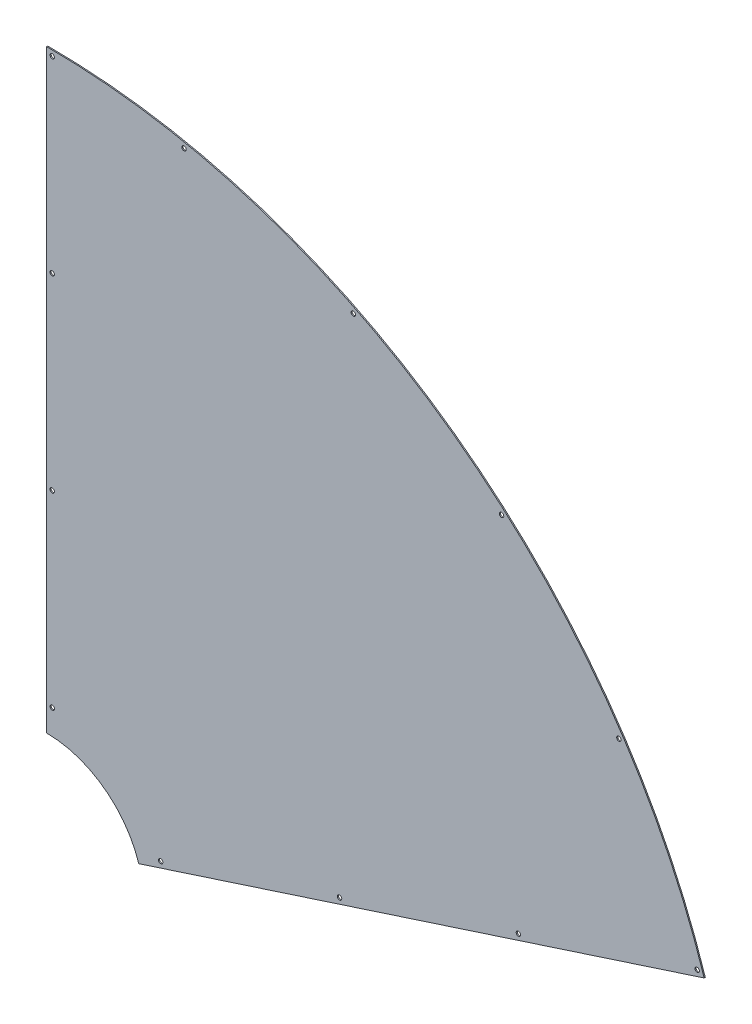
ISO-10303-21;
HEADER;
FILE_DESCRIPTION(('STEP AP214'),'2;1');
FILE_NAME('part.step','',(''),(''),'','','');
FILE_SCHEMA(('AUTOMOTIVE_DESIGN { 1 0 10303 214 1 1 1 1 }'));
ENDSEC;
DATA;
#1=APPLICATION_CONTEXT('core data for automotive mechanical design processes');
#2=APPLICATION_PROTOCOL_DEFINITION('international standard','automotive_design',2000,#1);
#3=PRODUCT_CONTEXT('',#1,'mechanical');
#4=PRODUCT('Part','Part','',(#3));
#5=PRODUCT_RELATED_PRODUCT_CATEGORY('part','',(#4));
#6=PRODUCT_DEFINITION_FORMATION('','',#4);
#7=PRODUCT_DEFINITION_CONTEXT('part definition',#1,'design');
#8=PRODUCT_DEFINITION('design','',#6,#7);
#9=PRODUCT_DEFINITION_SHAPE('','',#8);
#10=(LENGTH_UNIT() NAMED_UNIT(*) SI_UNIT(.MILLI.,.METRE.));
#11=(NAMED_UNIT(*) PLANE_ANGLE_UNIT() SI_UNIT($,.RADIAN.));
#12=(NAMED_UNIT(*) SI_UNIT($,.STERADIAN.) SOLID_ANGLE_UNIT());
#13=UNCERTAINTY_MEASURE_WITH_UNIT(LENGTH_MEASURE(1.E-05),#10,'distance_accuracy_value','');
#14=(GEOMETRIC_REPRESENTATION_CONTEXT(3) GLOBAL_UNCERTAINTY_ASSIGNED_CONTEXT((#13)) GLOBAL_UNIT_ASSIGNED_CONTEXT((#10,
#11,#12)) REPRESENTATION_CONTEXT('',''));
#15=CARTESIAN_POINT('',(0.,0.,0.));
#16=DIRECTION('',(0.,0.,1.));
#17=DIRECTION('',(1.,0.,0.));
#18=AXIS2_PLACEMENT_3D('',#15,#16,#17);
#19=CARTESIAN_POINT('',(248.343744291146,1214.87669525407,2.));
#20=DIRECTION('',(0.,0.,-1.));
#21=DIRECTION('',(-0.499999999999998,-0.86602540378444,0.));
#22=AXIS2_PLACEMENT_3D('',#19,#20,#21);
#23=CYLINDRICAL_SURFACE('',#22,3.99999999999999);
#24=CARTESIAN_POINT('',(248.343744291146,1214.87669525407,2.));
#25=DIRECTION('',(0.,0.,1.));
#26=DIRECTION('',(0.499999999999998,0.86602540378444,0.));
#27=AXIS2_PLACEMENT_3D('',#24,#25,#26);
#28=CIRCLE('',#27,3.99999999999999);
#29=CARTESIAN_POINT('',(250.343744291146,1218.34079686921,2.));
#30=VERTEX_POINT('',#29);
#31=EDGE_CURVE('E42',#30,#30,#28,.T.);
#32=ORIENTED_EDGE('',*,*,#31,.T.);
#33=EDGE_LOOP('',(#32));
#34=FACE_BOUND('',#33,.T.);
#35=CARTESIAN_POINT('',(248.343744291146,1214.87669525407,0.));
#36=DIRECTION('',(0.,0.,1.));
#37=DIRECTION('',(0.499999999999998,0.86602540378444,0.));
#38=AXIS2_PLACEMENT_3D('',#35,#36,#37);
#39=CIRCLE('',#38,3.99999999999999);
#40=CARTESIAN_POINT('',(250.343744291146,1218.34079686921,0.));
#41=VERTEX_POINT('',#40);
#42=EDGE_CURVE('E11',#41,#41,#39,.T.);
#43=ORIENTED_EDGE('',*,*,#42,.F.);
#44=EDGE_LOOP('',(#43));
#45=FACE_BOUND('',#44,.T.);
#46=ADVANCED_FACE('F34',(#34,#45),#23,.F.);
#47=CARTESIAN_POINT('',(554.314862591112,1109.204684948,2.));
#48=DIRECTION('',(0.,0.,-1.));
#49=DIRECTION('',(-0.707106781186546,-0.707106781186549,0.));
#50=AXIS2_PLACEMENT_3D('',#47,#48,#49);
#51=CYLINDRICAL_SURFACE('',#50,3.99999999999999);
#52=CARTESIAN_POINT('',(554.314862591112,1109.204684948,2.));
#53=DIRECTION('',(0.,0.,1.));
#54=DIRECTION('',(0.707106781186546,0.707106781186549,0.));
#55=AXIS2_PLACEMENT_3D('',#52,#53,#54);
#56=CIRCLE('',#55,3.99999999999999);
#57=CARTESIAN_POINT('',(557.143289715858,1112.03311207275,2.));
#58=VERTEX_POINT('',#57);
#59=EDGE_CURVE('E124',#58,#58,#56,.T.);
#60=ORIENTED_EDGE('',*,*,#59,.T.);
#61=EDGE_LOOP('',(#60));
#62=FACE_BOUND('',#61,.T.);
#63=CARTESIAN_POINT('',(554.314862591112,1109.204684948,0.));
#64=DIRECTION('',(0.,0.,1.));
#65=DIRECTION('',(0.707106781186546,0.707106781186549,0.));
#66=AXIS2_PLACEMENT_3D('',#63,#64,#65);
#67=CIRCLE('',#66,3.99999999999999);
#68=CARTESIAN_POINT('',(557.143289715858,1112.03311207275,0.));
#69=VERTEX_POINT('',#68);
#70=EDGE_CURVE('E127',#69,#69,#67,.T.);
#71=ORIENTED_EDGE('',*,*,#70,.F.);
#72=EDGE_LOOP('',(#71));
#73=FACE_BOUND('',#72,.T.);
#74=ADVANCED_FACE('F222',(#62,#73),#51,.F.);
#75=CARTESIAN_POINT('',(822.510339054116,927.942208410137,2.));
#76=DIRECTION('',(0.,0.,-1.));
#77=DIRECTION('',(-0.866025403784438,-0.500000000000001,0.));
#78=AXIS2_PLACEMENT_3D('',#75,#76,#77);
#79=CYLINDRICAL_SURFACE('',#78,3.99999999999999);
#80=CARTESIAN_POINT('',(822.510339054116,927.942208410137,2.));
#81=DIRECTION('',(0.,0.,1.));
#82=DIRECTION('',(0.866025403784438,0.500000000000001,0.));
#83=AXIS2_PLACEMENT_3D('',#80,#81,#82);
#84=CIRCLE('',#83,3.99999999999999);
#85=CARTESIAN_POINT('',(825.974440669254,929.942208410137,2.));
#86=VERTEX_POINT('',#85);
#87=EDGE_CURVE('E118',#86,#86,#84,.T.);
#88=ORIENTED_EDGE('',*,*,#87,.T.);
#89=EDGE_LOOP('',(#88));
#90=FACE_BOUND('',#89,.T.);
#91=CARTESIAN_POINT('',(822.510339054116,927.942208410137,0.));
#92=DIRECTION('',(0.,0.,1.));
#93=DIRECTION('',(0.866025403784438,0.500000000000001,0.));
#94=AXIS2_PLACEMENT_3D('',#91,#92,#93);
#95=CIRCLE('',#94,3.99999999999999);
#96=CARTESIAN_POINT('',(825.974440669254,929.942208410137,0.));
#97=VERTEX_POINT('',#96);
#98=EDGE_CURVE('E121',#97,#97,#95,.T.);
#99=ORIENTED_EDGE('',*,*,#98,.F.);
#100=EDGE_LOOP('',(#99));
#101=FACE_BOUND('',#100,.T.);
#102=ADVANCED_FACE('F226',(#90,#101),#79,.F.);
#103=CARTESIAN_POINT('',(1034.65309517319,683.442003866127,2.));
#104=DIRECTION('',(0.,0.,-1.));
#105=DIRECTION('',(-0.965925826289068,-0.258819045102521,0.));
#106=AXIS2_PLACEMENT_3D('',#103,#104,#105);
#107=CYLINDRICAL_SURFACE('',#106,3.99999999999999);
#108=CARTESIAN_POINT('',(1034.65309517319,683.442003866127,2.));
#109=DIRECTION('',(0.,0.,1.));
#110=DIRECTION('',(0.965925826289068,0.258819045102521,0.));
#111=AXIS2_PLACEMENT_3D('',#108,#109,#110);
#112=CIRCLE('',#111,3.99999999999999);
#113=CARTESIAN_POINT('',(1038.51679847834,684.477280046537,2.));
#114=VERTEX_POINT('',#113);
#115=EDGE_CURVE('E112',#114,#114,#112,.T.);
#116=ORIENTED_EDGE('',*,*,#115,.T.);
#117=EDGE_LOOP('',(#116));
#118=FACE_BOUND('',#117,.T.);
#119=CARTESIAN_POINT('',(1034.65309517319,683.442003866127,0.));
#120=DIRECTION('',(0.,0.,1.));
#121=DIRECTION('',(0.965925826289068,0.258819045102521,0.));
#122=AXIS2_PLACEMENT_3D('',#119,#120,#121);
#123=CIRCLE('',#122,3.99999999999999);
#124=CARTESIAN_POINT('',(1038.51679847834,684.477280046537,0.));
#125=VERTEX_POINT('',#124);
#126=EDGE_CURVE('E115',#125,#125,#123,.T.);
#127=ORIENTED_EDGE('',*,*,#126,.F.);
#128=EDGE_LOOP('',(#127));
#129=FACE_BOUND('',#128,.T.);
#130=ADVANCED_FACE('F137',(#118,#129),#107,.F.);
#131=CARTESIAN_POINT('',(0.,0.,2.));
#132=DIRECTION('',(0.,0.,1.));
#133=DIRECTION('',(1.,0.,0.));
#134=AXIS2_PLACEMENT_3D('',#131,#132,#133);
#135=PLANE('',#134);
#136=ORIENTED_EDGE('',*,*,#31,.F.);
#137=EDGE_LOOP('',(#136));
#138=FACE_BOUND('',#137,.T.);
#139=ORIENTED_EDGE('',*,*,#59,.F.);
#140=EDGE_LOOP('',(#139));
#141=FACE_BOUND('',#140,.T.);
#142=ORIENTED_EDGE('',*,*,#87,.F.);
#143=EDGE_LOOP('',(#142));
#144=FACE_BOUND('',#143,.T.);
#145=ORIENTED_EDGE('',*,*,#115,.F.);
#146=EDGE_LOOP('',(#145));
#147=FACE_BOUND('',#146,.T.);
#148=CARTESIAN_POINT('',(10.,1239.95967676372,2.));
#149=DIRECTION('',(0.,0.,1.));
#150=DIRECTION('',(1.,0.,0.));
#151=AXIS2_PLACEMENT_3D('',#148,#149,#150);
#152=CIRCLE('',#151,4.);
#153=CARTESIAN_POINT('',(14.,1239.95967676372,2.));
#154=VERTEX_POINT('',#153);
#155=EDGE_CURVE('E148',#154,#154,#152,.T.);
#156=ORIENTED_EDGE('',*,*,#155,.F.);
#157=EDGE_LOOP('',(#156));
#158=FACE_BOUND('',#157,.T.);
#159=CARTESIAN_POINT('',(10.0000000000001,559.959676763724,2.));
#160=DIRECTION('',(0.,0.,1.));
#161=DIRECTION('',(1.,0.,0.));
#162=AXIS2_PLACEMENT_3D('',#159,#160,#161);
#163=CIRCLE('',#162,4.);
#164=CARTESIAN_POINT('',(14.0000000000001,559.959676763724,2.));
#165=VERTEX_POINT('',#164);
#166=EDGE_CURVE('E152',#165,#165,#163,.T.);
#167=ORIENTED_EDGE('',*,*,#166,.F.);
#168=EDGE_LOOP('',(#167));
#169=FACE_BOUND('',#168,.T.);
#170=CARTESIAN_POINT('',(852.926737160934,287.30057811247,2.));
#171=DIRECTION('',(0.,0.,1.));
#172=DIRECTION('',(1.,0.,0.));
#173=AXIS2_PLACEMENT_3D('',#170,#171,#172);
#174=CIRCLE('',#173,3.99999999999999);
#175=CARTESIAN_POINT('',(856.926737160934,287.30057811247,2.));
#176=VERTEX_POINT('',#175);
#177=EDGE_CURVE('E156',#176,#176,#174,.T.);
#178=ORIENTED_EDGE('',*,*,#177,.F.);
#179=EDGE_LOOP('',(#178));
#180=FACE_BOUND('',#179,.T.);
#181=CARTESIAN_POINT('',(206.086847975223,77.5435693609763,2.));
#182=DIRECTION('',(0.,0.,1.));
#183=DIRECTION('',(1.,0.,0.));
#184=AXIS2_PLACEMENT_3D('',#181,#182,#183);
#185=CIRCLE('',#184,3.99999999999999);
#186=CARTESIAN_POINT('',(210.086847975223,77.5435693609763,2.));
#187=VERTEX_POINT('',#186);
#188=EDGE_CURVE('E105',#187,#187,#185,.T.);
#189=ORIENTED_EDGE('',*,*,#188,.F.);
#190=EDGE_LOOP('',(#189));
#191=FACE_BOUND('',#190,.T.);
#192=CARTESIAN_POINT('',(0.,0.,2.));
#193=DIRECTION('',(0.,0.,1.));
#194=DIRECTION('',(1.,0.,0.));
#195=AXIS2_PLACEMENT_3D('',#192,#193,#194);
#196=CIRCLE('',#195,1250.);
#197=CARTESIAN_POINT('',(1188.92250846813,385.957599818763,2.));
#198=VERTEX_POINT('',#197);
#199=CARTESIAN_POINT('',(0.,1250.,2.));
#200=VERTEX_POINT('',#199);
#201=EDGE_CURVE('E87',#198,#200,#196,.T.);
#202=ORIENTED_EDGE('',*,*,#201,.T.);
#203=DIRECTION('',(0.,-1.,0.));
#204=VECTOR('',#203,1.);
#205=CARTESIAN_POINT('',(0.,1250.,2.));
#206=LINE('',#205,#204);
#207=CARTESIAN_POINT('',(0.,175.,2.));
#208=VERTEX_POINT('',#207);
#209=EDGE_CURVE('E81',#200,#208,#206,.T.);
#210=ORIENTED_EDGE('',*,*,#209,.T.);
#211=CARTESIAN_POINT('',(0.,0.,2.));
#212=DIRECTION('',(0.,0.,-1.));
#213=DIRECTION('',(1.,0.,0.));
#214=AXIS2_PLACEMENT_3D('',#211,#212,#213);
#215=CIRCLE('',#214,175.);
#216=CARTESIAN_POINT('',(166.536499319094,53.7642482932808,2.));
#217=VERTEX_POINT('',#216);
#218=EDGE_CURVE('E85',#208,#217,#215,.T.);
#219=ORIENTED_EDGE('',*,*,#218,.T.);
#220=DIRECTION('',(0.951056516295152,0.309016994374952,0.));
#221=VECTOR('',#220,1.);
#222=CARTESIAN_POINT('',(166.536499319094,53.7642482932808,2.));
#223=LINE('',#222,#221);
#224=EDGE_CURVE('E50',#217,#198,#223,.T.);
#225=ORIENTED_EDGE('',*,*,#224,.T.);
#226=EDGE_LOOP('',(#202,#210,#219,#225));
#227=FACE_BOUND('',#226,.T.);
#228=CARTESIAN_POINT('',(529.567521620582,182.234800024986,2.));
#229=DIRECTION('',(0.,0.,1.));
#230=DIRECTION('',(1.,0.,0.));
#231=AXIS2_PLACEMENT_3D('',#228,#229,#230);
#232=CIRCLE('',#231,3.99999999999999);
#233=CARTESIAN_POINT('',(533.567521620582,182.234800024986,2.));
#234=VERTEX_POINT('',#233);
#235=EDGE_CURVE('E163',#234,#234,#232,.T.);
#236=ORIENTED_EDGE('',*,*,#235,.F.);
#237=EDGE_LOOP('',(#236));
#238=FACE_BOUND('',#237,.T.);
#239=CARTESIAN_POINT('',(10.0000000000001,219.959676763724,2.));
#240=DIRECTION('',(0.,0.,1.));
#241=DIRECTION('',(1.,0.,0.));
#242=AXIS2_PLACEMENT_3D('',#239,#240,#241);
#243=CIRCLE('',#242,4.);
#244=CARTESIAN_POINT('',(14.0000000000001,219.959676763724,2.));
#245=VERTEX_POINT('',#244);
#246=EDGE_CURVE('E174',#245,#245,#243,.T.);
#247=ORIENTED_EDGE('',*,*,#246,.F.);
#248=EDGE_LOOP('',(#247));
#249=FACE_BOUND('',#248,.T.);
#250=CARTESIAN_POINT('',(10.,899.959676763724,2.));
#251=DIRECTION('',(0.,0.,1.));
#252=DIRECTION('',(1.,0.,0.));
#253=AXIS2_PLACEMENT_3D('',#250,#251,#252);
#254=CIRCLE('',#253,4.);
#255=CARTESIAN_POINT('',(14.,899.959676763724,2.));
#256=VERTEX_POINT('',#255);
#257=EDGE_CURVE('E184',#256,#256,#254,.T.);
#258=ORIENTED_EDGE('',*,*,#257,.F.);
#259=EDGE_LOOP('',(#258));
#260=FACE_BOUND('',#259,.T.);
#261=CARTESIAN_POINT('',(1176.28595270129,392.366356199954,2.));
#262=DIRECTION('',(0.,0.,1.));
#263=DIRECTION('',(1.,0.,0.));
#264=AXIS2_PLACEMENT_3D('',#261,#262,#263);
#265=CIRCLE('',#264,3.99999999999999);
#266=CARTESIAN_POINT('',(1180.28595270129,392.366356199954,2.));
#267=VERTEX_POINT('',#266);
#268=EDGE_CURVE('E194',#267,#267,#265,.T.);
#269=ORIENTED_EDGE('',*,*,#268,.F.);
#270=EDGE_LOOP('',(#269));
#271=FACE_BOUND('',#270,.T.);
#272=ADVANCED_FACE('F82',(#138,#141,#144,#147,#158,#169,#180,#191,#227,#238,#249,#260,#271),
#135,.T.);
#273=CARTESIAN_POINT('',(0.,0.,0.));
#274=DIRECTION('',(0.,0.,1.));
#275=DIRECTION('',(1.,0.,0.));
#276=AXIS2_PLACEMENT_3D('',#273,#274,#275);
#277=PLANE('',#276);
#278=ORIENTED_EDGE('',*,*,#42,.T.);
#279=EDGE_LOOP('',(#278));
#280=FACE_BOUND('',#279,.T.);
#281=ORIENTED_EDGE('',*,*,#70,.T.);
#282=EDGE_LOOP('',(#281));
#283=FACE_BOUND('',#282,.T.);
#284=ORIENTED_EDGE('',*,*,#98,.T.);
#285=EDGE_LOOP('',(#284));
#286=FACE_BOUND('',#285,.T.);
#287=ORIENTED_EDGE('',*,*,#126,.T.);
#288=EDGE_LOOP('',(#287));
#289=FACE_BOUND('',#288,.T.);
#290=CARTESIAN_POINT('',(0.,0.,0.));
#291=DIRECTION('',(0.,0.,1.));
#292=DIRECTION('',(1.,0.,0.));
#293=AXIS2_PLACEMENT_3D('',#290,#291,#292);
#294=CIRCLE('',#293,1250.);
#295=CARTESIAN_POINT('',(1188.92250846813,385.957599818763,0.));
#296=VERTEX_POINT('',#295);
#297=CARTESIAN_POINT('',(0.,1250.,0.));
#298=VERTEX_POINT('',#297);
#299=EDGE_CURVE('E102',#296,#298,#294,.T.);
#300=ORIENTED_EDGE('',*,*,#299,.F.);
#301=DIRECTION('',(0.951056516295152,0.309016994374952,0.));
#302=VECTOR('',#301,1.);
#303=CARTESIAN_POINT('',(166.536499319094,53.7642482932808,0.));
#304=LINE('',#303,#302);
#305=CARTESIAN_POINT('',(166.536499319094,53.7642482932808,0.));
#306=VERTEX_POINT('',#305);
#307=EDGE_CURVE('E73',#306,#296,#304,.T.);
#308=ORIENTED_EDGE('',*,*,#307,.F.);
#309=CARTESIAN_POINT('',(0.,0.,0.));
#310=DIRECTION('',(0.,0.,-1.));
#311=DIRECTION('',(1.,0.,0.));
#312=AXIS2_PLACEMENT_3D('',#309,#310,#311);
#313=CIRCLE('',#312,175.);
#314=CARTESIAN_POINT('',(0.,175.,0.));
#315=VERTEX_POINT('',#314);
#316=EDGE_CURVE('E67',#315,#306,#313,.T.);
#317=ORIENTED_EDGE('',*,*,#316,.F.);
#318=DIRECTION('',(0.,-1.,0.));
#319=VECTOR('',#318,1.);
#320=CARTESIAN_POINT('',(0.,1250.,0.));
#321=LINE('',#320,#319);
#322=EDGE_CURVE('E92',#298,#315,#321,.T.);
#323=ORIENTED_EDGE('',*,*,#322,.F.);
#324=EDGE_LOOP('',(#300,#308,#317,#323));
#325=FACE_BOUND('',#324,.T.);
#326=CARTESIAN_POINT('',(206.086847975223,77.5435693609763,0.));
#327=DIRECTION('',(0.,0.,1.));
#328=DIRECTION('',(1.,0.,0.));
#329=AXIS2_PLACEMENT_3D('',#326,#327,#328);
#330=CIRCLE('',#329,3.99999999999999);
#331=CARTESIAN_POINT('',(210.086847975223,77.5435693609763,0.));
#332=VERTEX_POINT('',#331);
#333=EDGE_CURVE('E160',#332,#332,#330,.T.);
#334=ORIENTED_EDGE('',*,*,#333,.T.);
#335=EDGE_LOOP('',(#334));
#336=FACE_BOUND('',#335,.T.);
#337=CARTESIAN_POINT('',(529.567521620582,182.234800024986,0.));
#338=DIRECTION('',(0.,0.,1.));
#339=DIRECTION('',(1.,0.,0.));
#340=AXIS2_PLACEMENT_3D('',#337,#338,#339);
#341=CIRCLE('',#340,3.99999999999999);
#342=CARTESIAN_POINT('',(533.567521620582,182.234800024986,0.));
#343=VERTEX_POINT('',#342);
#344=EDGE_CURVE('E166',#343,#343,#341,.T.);
#345=ORIENTED_EDGE('',*,*,#344,.T.);
#346=EDGE_LOOP('',(#345));
#347=FACE_BOUND('',#346,.T.);
#348=CARTESIAN_POINT('',(852.926737160934,287.30057811247,0.));
#349=DIRECTION('',(0.,0.,1.));
#350=DIRECTION('',(1.,0.,0.));
#351=AXIS2_PLACEMENT_3D('',#348,#349,#350);
#352=CIRCLE('',#351,3.99999999999999);
#353=CARTESIAN_POINT('',(856.926737160934,287.30057811247,0.));
#354=VERTEX_POINT('',#353);
#355=EDGE_CURVE('E171',#354,#354,#352,.T.);
#356=ORIENTED_EDGE('',*,*,#355,.T.);
#357=EDGE_LOOP('',(#356));
#358=FACE_BOUND('',#357,.T.);
#359=CARTESIAN_POINT('',(10.0000000000001,219.959676763724,0.));
#360=DIRECTION('',(0.,0.,1.));
#361=DIRECTION('',(1.,0.,0.));
#362=AXIS2_PLACEMENT_3D('',#359,#360,#361);
#363=CIRCLE('',#362,4.);
#364=CARTESIAN_POINT('',(14.0000000000001,219.959676763724,0.));
#365=VERTEX_POINT('',#364);
#366=EDGE_CURVE('E176',#365,#365,#363,.T.);
#367=ORIENTED_EDGE('',*,*,#366,.T.);
#368=EDGE_LOOP('',(#367));
#369=FACE_BOUND('',#368,.T.);
#370=CARTESIAN_POINT('',(10.0000000000001,559.959676763724,0.));
#371=DIRECTION('',(0.,0.,1.));
#372=DIRECTION('',(1.,0.,0.));
#373=AXIS2_PLACEMENT_3D('',#370,#371,#372);
#374=CIRCLE('',#373,4.);
#375=CARTESIAN_POINT('',(14.0000000000001,559.959676763724,0.));
#376=VERTEX_POINT('',#375);
#377=EDGE_CURVE('E181',#376,#376,#374,.T.);
#378=ORIENTED_EDGE('',*,*,#377,.T.);
#379=EDGE_LOOP('',(#378));
#380=FACE_BOUND('',#379,.T.);
#381=CARTESIAN_POINT('',(10.,899.959676763724,0.));
#382=DIRECTION('',(0.,0.,1.));
#383=DIRECTION('',(1.,0.,0.));
#384=AXIS2_PLACEMENT_3D('',#381,#382,#383);
#385=CIRCLE('',#384,4.);
#386=CARTESIAN_POINT('',(14.,899.959676763724,0.));
#387=VERTEX_POINT('',#386);
#388=EDGE_CURVE('E186',#387,#387,#385,.T.);
#389=ORIENTED_EDGE('',*,*,#388,.T.);
#390=EDGE_LOOP('',(#389));
#391=FACE_BOUND('',#390,.T.);
#392=CARTESIAN_POINT('',(10.,1239.95967676372,0.));
#393=DIRECTION('',(0.,0.,1.));
#394=DIRECTION('',(1.,0.,0.));
#395=AXIS2_PLACEMENT_3D('',#392,#393,#394);
#396=CIRCLE('',#395,4.);
#397=CARTESIAN_POINT('',(14.,1239.95967676372,0.));
#398=VERTEX_POINT('',#397);
#399=EDGE_CURVE('E191',#398,#398,#396,.T.);
#400=ORIENTED_EDGE('',*,*,#399,.T.);
#401=EDGE_LOOP('',(#400));
#402=FACE_BOUND('',#401,.T.);
#403=CARTESIAN_POINT('',(1176.28595270129,392.366356199954,0.));
#404=DIRECTION('',(0.,0.,1.));
#405=DIRECTION('',(1.,0.,0.));
#406=AXIS2_PLACEMENT_3D('',#403,#404,#405);
#407=CIRCLE('',#406,3.99999999999999);
#408=CARTESIAN_POINT('',(1180.28595270129,392.366356199954,0.));
#409=VERTEX_POINT('',#408);
#410=EDGE_CURVE('E196',#409,#409,#407,.T.);
#411=ORIENTED_EDGE('',*,*,#410,.T.);
#412=EDGE_LOOP('',(#411));
#413=FACE_BOUND('',#412,.T.);
#414=ADVANCED_FACE('F136',(#280,#283,#286,#289,#325,#336,#347,#358,#369,#380,#391,#402,#413),
#277,.F.);
#415=CARTESIAN_POINT('',(0.,0.,2.));
#416=DIRECTION('',(0.,0.,-1.));
#417=DIRECTION('',(-1.,0.,0.));
#418=AXIS2_PLACEMENT_3D('',#415,#416,#417);
#419=CYLINDRICAL_SURFACE('',#418,1250.);
#420=ORIENTED_EDGE('',*,*,#299,.T.);
#421=DIRECTION('',(0.,0.,-1.));
#422=VECTOR('',#421,1.);
#423=CARTESIAN_POINT('',(0.,1250.,2.));
#424=LINE('',#423,#422);
#425=EDGE_CURVE('E93',#200,#298,#424,.T.);
#426=ORIENTED_EDGE('',*,*,#425,.F.);
#427=ORIENTED_EDGE('',*,*,#201,.F.);
#428=DIRECTION('',(0.,0.,-1.));
#429=VECTOR('',#428,1.);
#430=CARTESIAN_POINT('',(1188.92250846813,385.957599818763,2.));
#431=LINE('',#430,#429);
#432=EDGE_CURVE('E98',#198,#296,#431,.T.);
#433=ORIENTED_EDGE('',*,*,#432,.T.);
#434=EDGE_LOOP('',(#420,#426,#427,#433));
#435=FACE_BOUND('',#434,.T.);
#436=ADVANCED_FACE('F211',(#435),#419,.T.);
#437=CARTESIAN_POINT('',(0.,1250.,2.));
#438=DIRECTION('',(1.,0.,0.));
#439=DIRECTION('',(0.,0.,-1.));
#440=AXIS2_PLACEMENT_3D('',#437,#438,#439);
#441=PLANE('',#440);
#442=ORIENTED_EDGE('',*,*,#322,.T.);
#443=DIRECTION('',(0.,0.,-1.));
#444=VECTOR('',#443,1.);
#445=CARTESIAN_POINT('',(0.,175.,2.));
#446=LINE('',#445,#444);
#447=EDGE_CURVE('E90',#208,#315,#446,.T.);
#448=ORIENTED_EDGE('',*,*,#447,.F.);
#449=ORIENTED_EDGE('',*,*,#209,.F.);
#450=ORIENTED_EDGE('',*,*,#425,.T.);
#451=EDGE_LOOP('',(#442,#448,#449,#450));
#452=FACE_BOUND('',#451,.T.);
#453=ADVANCED_FACE('F91',(#452),#441,.F.);
#454=CARTESIAN_POINT('',(0.,0.,2.));
#455=DIRECTION('',(0.,0.,-1.));
#456=DIRECTION('',(-1.,0.,0.));
#457=AXIS2_PLACEMENT_3D('',#454,#455,#456);
#458=CYLINDRICAL_SURFACE('',#457,175.);
#459=ORIENTED_EDGE('',*,*,#316,.T.);
#460=DIRECTION('',(0.,0.,-1.));
#461=VECTOR('',#460,1.);
#462=CARTESIAN_POINT('',(166.536499319094,53.7642482932808,2.));
#463=LINE('',#462,#461);
#464=EDGE_CURVE('E94',#217,#306,#463,.T.);
#465=ORIENTED_EDGE('',*,*,#464,.F.);
#466=ORIENTED_EDGE('',*,*,#218,.F.);
#467=ORIENTED_EDGE('',*,*,#447,.T.);
#468=EDGE_LOOP('',(#459,#465,#466,#467));
#469=FACE_BOUND('',#468,.T.);
#470=ADVANCED_FACE('F96',(#469),#458,.F.);
#471=CARTESIAN_POINT('',(166.536499319094,53.7642482932808,2.));
#472=DIRECTION('',(-0.309016994374952,0.951056516295152,0.));
#473=DIRECTION('',(-0.951056516295152,-0.309016994374952,0.));
#474=AXIS2_PLACEMENT_3D('',#471,#472,#473);
#475=PLANE('',#474);
#476=ORIENTED_EDGE('',*,*,#307,.T.);
#477=ORIENTED_EDGE('',*,*,#432,.F.);
#478=ORIENTED_EDGE('',*,*,#224,.F.);
#479=ORIENTED_EDGE('',*,*,#464,.T.);
#480=EDGE_LOOP('',(#476,#477,#478,#479));
#481=FACE_BOUND('',#480,.T.);
#482=ADVANCED_FACE('F241',(#481),#475,.F.);
#483=CARTESIAN_POINT('',(206.086847975223,77.5435693609763,2.));
#484=DIRECTION('',(0.,0.,-1.));
#485=DIRECTION('',(-1.,0.,0.));
#486=AXIS2_PLACEMENT_3D('',#483,#484,#485);
#487=CYLINDRICAL_SURFACE('',#486,3.99999999999999);
#488=ORIENTED_EDGE('',*,*,#188,.T.);
#489=EDGE_LOOP('',(#488));
#490=FACE_BOUND('',#489,.T.);
#491=ORIENTED_EDGE('',*,*,#333,.F.);
#492=EDGE_LOOP('',(#491));
#493=FACE_BOUND('',#492,.T.);
#494=ADVANCED_FACE('F243',(#490,#493),#487,.F.);
#495=CARTESIAN_POINT('',(529.567521620582,182.234800024986,2.));
#496=DIRECTION('',(0.,0.,-1.));
#497=DIRECTION('',(-1.,0.,0.));
#498=AXIS2_PLACEMENT_3D('',#495,#496,#497);
#499=CYLINDRICAL_SURFACE('',#498,3.99999999999999);
#500=ORIENTED_EDGE('',*,*,#235,.T.);
#501=EDGE_LOOP('',(#500));
#502=FACE_BOUND('',#501,.T.);
#503=ORIENTED_EDGE('',*,*,#344,.F.);
#504=EDGE_LOOP('',(#503));
#505=FACE_BOUND('',#504,.T.);
#506=ADVANCED_FACE('F247',(#502,#505),#499,.F.);
#507=CARTESIAN_POINT('',(852.926737160934,287.30057811247,2.));
#508=DIRECTION('',(0.,0.,-1.));
#509=DIRECTION('',(-1.,0.,0.));
#510=AXIS2_PLACEMENT_3D('',#507,#508,#509);
#511=CYLINDRICAL_SURFACE('',#510,3.99999999999999);
#512=ORIENTED_EDGE('',*,*,#177,.T.);
#513=EDGE_LOOP('',(#512));
#514=FACE_BOUND('',#513,.T.);
#515=ORIENTED_EDGE('',*,*,#355,.F.);
#516=EDGE_LOOP('',(#515));
#517=FACE_BOUND('',#516,.T.);
#518=ADVANCED_FACE('F252',(#514,#517),#511,.F.);
#519=CARTESIAN_POINT('',(10.0000000000001,219.959676763724,2.));
#520=DIRECTION('',(0.,0.,-1.));
#521=DIRECTION('',(-1.,0.,0.));
#522=AXIS2_PLACEMENT_3D('',#519,#520,#521);
#523=CYLINDRICAL_SURFACE('',#522,4.);
#524=ORIENTED_EDGE('',*,*,#246,.T.);
#525=EDGE_LOOP('',(#524));
#526=FACE_BOUND('',#525,.T.);
#527=ORIENTED_EDGE('',*,*,#366,.F.);
#528=EDGE_LOOP('',(#527));
#529=FACE_BOUND('',#528,.T.);
#530=ADVANCED_FACE('F259',(#526,#529),#523,.F.);
#531=CARTESIAN_POINT('',(10.0000000000001,559.959676763724,2.));
#532=DIRECTION('',(0.,0.,-1.));
#533=DIRECTION('',(-1.,0.,0.));
#534=AXIS2_PLACEMENT_3D('',#531,#532,#533);
#535=CYLINDRICAL_SURFACE('',#534,4.);
#536=ORIENTED_EDGE('',*,*,#166,.T.);
#537=EDGE_LOOP('',(#536));
#538=FACE_BOUND('',#537,.T.);
#539=ORIENTED_EDGE('',*,*,#377,.F.);
#540=EDGE_LOOP('',(#539));
#541=FACE_BOUND('',#540,.T.);
#542=ADVANCED_FACE('F263',(#538,#541),#535,.F.);
#543=CARTESIAN_POINT('',(10.,899.959676763724,2.));
#544=DIRECTION('',(0.,0.,-1.));
#545=DIRECTION('',(-1.,0.,0.));
#546=AXIS2_PLACEMENT_3D('',#543,#544,#545);
#547=CYLINDRICAL_SURFACE('',#546,4.);
#548=ORIENTED_EDGE('',*,*,#257,.T.);
#549=EDGE_LOOP('',(#548));
#550=FACE_BOUND('',#549,.T.);
#551=ORIENTED_EDGE('',*,*,#388,.F.);
#552=EDGE_LOOP('',(#551));
#553=FACE_BOUND('',#552,.T.);
#554=ADVANCED_FACE('F267',(#550,#553),#547,.F.);
#555=CARTESIAN_POINT('',(10.,1239.95967676372,2.));
#556=DIRECTION('',(0.,0.,-1.));
#557=DIRECTION('',(-1.,0.,0.));
#558=AXIS2_PLACEMENT_3D('',#555,#556,#557);
#559=CYLINDRICAL_SURFACE('',#558,4.);
#560=ORIENTED_EDGE('',*,*,#155,.T.);
#561=EDGE_LOOP('',(#560));
#562=FACE_BOUND('',#561,.T.);
#563=ORIENTED_EDGE('',*,*,#399,.F.);
#564=EDGE_LOOP('',(#563));
#565=FACE_BOUND('',#564,.T.);
#566=ADVANCED_FACE('F206',(#562,#565),#559,.F.);
#567=CARTESIAN_POINT('',(1176.28595270129,392.366356199954,2.));
#568=DIRECTION('',(0.,0.,-1.));
#569=DIRECTION('',(-1.,0.,0.));
#570=AXIS2_PLACEMENT_3D('',#567,#568,#569);
#571=CYLINDRICAL_SURFACE('',#570,3.99999999999999);
#572=ORIENTED_EDGE('',*,*,#268,.T.);
#573=EDGE_LOOP('',(#572));
#574=FACE_BOUND('',#573,.T.);
#575=ORIENTED_EDGE('',*,*,#410,.F.);
#576=EDGE_LOOP('',(#575));
#577=FACE_BOUND('',#576,.T.);
#578=ADVANCED_FACE('F202',(#574,#577),#571,.F.);
#579=CLOSED_SHELL('',(#46,#74,#102,#130,#272,#414,#436,#453,#470,#482,#494,#506,#518,#530,#542,
#554,#566,#578));
#580=MANIFOLD_SOLID_BREP('B2',#579);
#581=ADVANCED_BREP_SHAPE_REPRESENTATION('',(#18,#580),#14);
#582=SHAPE_DEFINITION_REPRESENTATION(#9,#581);
ENDSEC;
END-ISO-10303-21;
